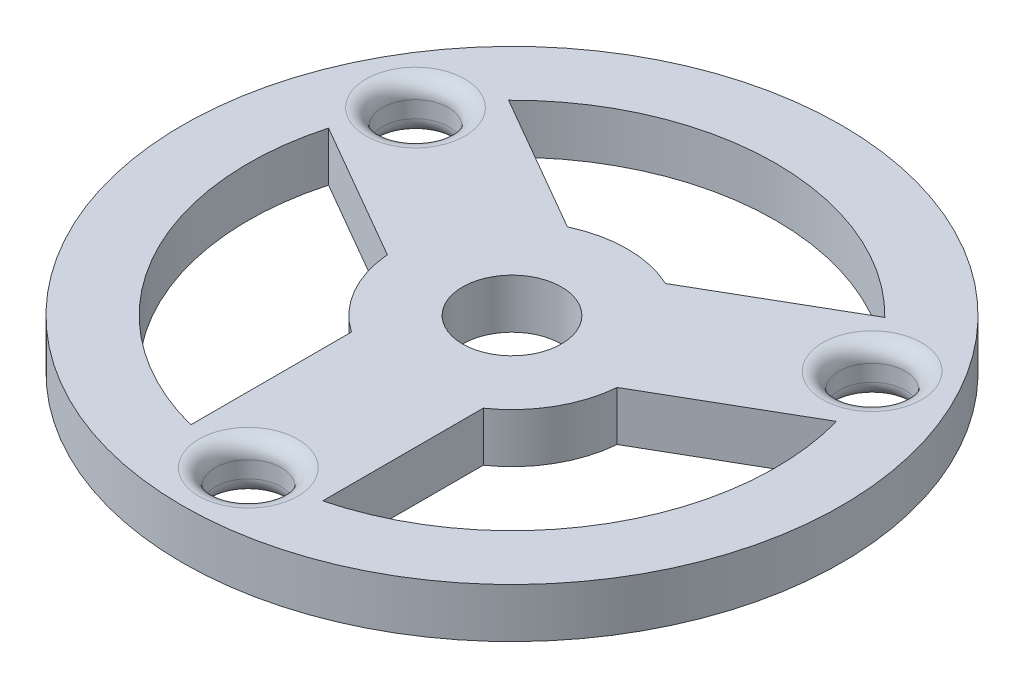
ISO-10303-21;
HEADER;
FILE_DESCRIPTION(('STEP AP214'),'2;1');
FILE_NAME('part.step','',(''),(''),'','','');
FILE_SCHEMA(('AUTOMOTIVE_DESIGN { 1 0 10303 214 1 1 1 1 }'));
ENDSEC;
DATA;
#1=APPLICATION_CONTEXT('core data for automotive mechanical design processes');
#2=APPLICATION_PROTOCOL_DEFINITION('international standard','automotive_design',2000,#1);
#3=PRODUCT_CONTEXT('',#1,'mechanical');
#4=PRODUCT('Part','Part','',(#3));
#5=PRODUCT_RELATED_PRODUCT_CATEGORY('part','',(#4));
#6=PRODUCT_DEFINITION_FORMATION('','',#4);
#7=PRODUCT_DEFINITION_CONTEXT('part definition',#1,'design');
#8=PRODUCT_DEFINITION('design','',#6,#7);
#9=PRODUCT_DEFINITION_SHAPE('','',#8);
#10=(LENGTH_UNIT() NAMED_UNIT(*) SI_UNIT(.MILLI.,.METRE.));
#11=(NAMED_UNIT(*) PLANE_ANGLE_UNIT() SI_UNIT($,.RADIAN.));
#12=(NAMED_UNIT(*) SI_UNIT($,.STERADIAN.) SOLID_ANGLE_UNIT());
#13=UNCERTAINTY_MEASURE_WITH_UNIT(LENGTH_MEASURE(1.E-05),#10,'distance_accuracy_value','');
#14=(GEOMETRIC_REPRESENTATION_CONTEXT(3) GLOBAL_UNCERTAINTY_ASSIGNED_CONTEXT((#13)) GLOBAL_UNIT_ASSIGNED_CONTEXT((#10,
#11,#12)) REPRESENTATION_CONTEXT('',''));
#15=CARTESIAN_POINT('',(0.,0.,0.));
#16=DIRECTION('',(0.,0.,1.));
#17=DIRECTION('',(1.,0.,0.));
#18=AXIS2_PLACEMENT_3D('',#15,#16,#17);
#19=CARTESIAN_POINT('',(0.,1.5,0.));
#20=DIRECTION('',(0.,1.,0.));
#21=DIRECTION('',(0.,0.,1.));
#22=AXIS2_PLACEMENT_3D('',#19,#20,#21);
#23=PLANE('',#22);
#24=CARTESIAN_POINT('',(0.,1.5,8.));
#25=DIRECTION('',(0.,1.,0.));
#26=DIRECTION('',(0.,0.,1.));
#27=AXIS2_PLACEMENT_3D('',#24,#25,#26);
#28=CIRCLE('',#27,1.5);
#29=CARTESIAN_POINT('',(0.,1.5,9.5));
#30=VERTEX_POINT('',#29);
#31=EDGE_CURVE('E249',#30,#30,#28,.F.);
#32=ORIENTED_EDGE('',*,*,#31,.T.);
#33=EDGE_LOOP('',(#32));
#34=FACE_BOUND('',#33,.T.);
#35=CARTESIAN_POINT('',(6.92820323027549,1.5,-4.00000000000003));
#36=DIRECTION('',(0.,1.,0.));
#37=DIRECTION('',(0.,0.,1.));
#38=AXIS2_PLACEMENT_3D('',#35,#36,#37);
#39=CIRCLE('',#38,1.5);
#40=CARTESIAN_POINT('',(6.92820323027549,1.5,-2.50000000000003));
#41=VERTEX_POINT('',#40);
#42=EDGE_CURVE('E246',#41,#41,#39,.F.);
#43=ORIENTED_EDGE('',*,*,#42,.T.);
#44=EDGE_LOOP('',(#43));
#45=FACE_BOUND('',#44,.T.);
#46=CARTESIAN_POINT('',(-6.92820323027552,1.5,-3.99999999999998));
#47=DIRECTION('',(0.,1.,0.));
#48=DIRECTION('',(0.,0.,1.));
#49=AXIS2_PLACEMENT_3D('',#46,#47,#48);
#50=CIRCLE('',#49,1.5);
#51=CARTESIAN_POINT('',(-6.92820323027552,1.5,-2.49999999999998));
#52=VERTEX_POINT('',#51);
#53=EDGE_CURVE('E243',#52,#52,#50,.F.);
#54=ORIENTED_EDGE('',*,*,#53,.T.);
#55=EDGE_LOOP('',(#54));
#56=FACE_BOUND('',#55,.T.);
#57=CARTESIAN_POINT('',(0.,1.5,0.));
#58=DIRECTION('',(0.,1.,0.));
#59=DIRECTION('',(0.,0.,1.));
#60=AXIS2_PLACEMENT_3D('',#57,#58,#59);
#61=CIRCLE('',#60,1.5);
#62=CARTESIAN_POINT('',(0.,1.5,1.5));
#63=VERTEX_POINT('',#62);
#64=EDGE_CURVE('E226',#63,#63,#61,.T.);
#65=ORIENTED_EDGE('',*,*,#64,.F.);
#66=EDGE_LOOP('',(#65));
#67=FACE_BOUND('',#66,.T.);
#68=CARTESIAN_POINT('',(0.,1.5,0.));
#69=DIRECTION('',(0.,1.,0.));
#70=DIRECTION('',(0.,0.,1.));
#71=AXIS2_PLACEMENT_3D('',#68,#69,#70);
#72=CIRCLE('',#71,10.);
#73=CARTESIAN_POINT('',(0.,1.5,10.));
#74=VERTEX_POINT('',#73);
#75=EDGE_CURVE('E232',#74,#74,#72,.T.);
#76=ORIENTED_EDGE('',*,*,#75,.T.);
#77=EDGE_LOOP('',(#76));
#78=FACE_BOUND('',#77,.T.);
#79=DIRECTION('',(0.86602540378444,0.,0.499999999999998));
#80=VECTOR('',#79,1.);
#81=CARTESIAN_POINT('',(-5.70820393249938,1.5,-5.60503415377628));
#82=LINE('',#81,#80);
#83=CARTESIAN_POINT('',(-5.70820393249938,1.5,-5.60503415377628));
#84=VERTEX_POINT('',#83);
#85=CARTESIAN_POINT('',(-1.48746859276656,1.5,-3.16819146920338));
#86=VERTEX_POINT('',#85);
#87=EDGE_CURVE('E197',#84,#86,#82,.T.);
#88=ORIENTED_EDGE('',*,*,#87,.F.);
#89=CARTESIAN_POINT('',(0.,1.5,0.));
#90=DIRECTION('',(0.,1.,0.));
#91=DIRECTION('',(0.,0.,-1.));
#92=AXIS2_PLACEMENT_3D('',#89,#90,#91);
#93=CIRCLE('',#92,8.);
#94=CARTESIAN_POINT('',(5.70820393249935,1.5,-5.60503415377632));
#95=VERTEX_POINT('',#94);
#96=EDGE_CURVE('E195',#95,#84,#93,.T.);
#97=ORIENTED_EDGE('',*,*,#96,.F.);
#98=DIRECTION('',(0.866025403784436,0.,-0.500000000000004));
#99=VECTOR('',#98,1.);
#100=CARTESIAN_POINT('',(1.48746859276654,1.5,-3.16819146920339));
#101=LINE('',#100,#99);
#102=CARTESIAN_POINT('',(1.48746859276654,1.5,-3.16819146920339));
#103=VERTEX_POINT('',#102);
#104=EDGE_CURVE('E203',#103,#95,#101,.T.);
#105=ORIENTED_EDGE('',*,*,#104,.F.);
#106=CARTESIAN_POINT('',(0.,1.5,0.));
#107=DIRECTION('',(0.,-1.,0.));
#108=DIRECTION('',(0.,0.,-1.));
#109=AXIS2_PLACEMENT_3D('',#106,#107,#108);
#110=CIRCLE('',#109,3.5);
#111=EDGE_CURVE('E200',#86,#103,#110,.T.);
#112=ORIENTED_EDGE('',*,*,#111,.F.);
#113=EDGE_LOOP('',(#88,#97,#105,#112));
#114=FACE_BOUND('',#113,.T.);
#115=DIRECTION('',(-0.86602540378444,0.,0.499999999999998));
#116=VECTOR('',#115,1.);
#117=CARTESIAN_POINT('',(7.70820393249937,1.5,-2.14093253863852));
#118=LINE('',#117,#116);
#119=CARTESIAN_POINT('',(7.70820393249937,1.5,-2.14093253863852));
#120=VERTEX_POINT('',#119);
#121=CARTESIAN_POINT('',(3.48746859276655,1.5,0.295910145934377));
#122=VERTEX_POINT('',#121);
#123=EDGE_CURVE('E166',#120,#122,#118,.T.);
#124=ORIENTED_EDGE('',*,*,#123,.F.);
#125=CARTESIAN_POINT('',(0.,1.5,0.));
#126=DIRECTION('',(0.,1.,0.));
#127=DIRECTION('',(0.,0.,-1.));
#128=AXIS2_PLACEMENT_3D('',#125,#126,#127);
#129=CIRCLE('',#128,8.);
#130=CARTESIAN_POINT('',(2.,1.5,7.74596669241484));
#131=VERTEX_POINT('',#130);
#132=EDGE_CURVE('E164',#131,#120,#129,.T.);
#133=ORIENTED_EDGE('',*,*,#132,.F.);
#134=DIRECTION('',(0.,0.,1.));
#135=VECTOR('',#134,1.);
#136=CARTESIAN_POINT('',(2.,1.5,2.87228132326902));
#137=LINE('',#136,#135);
#138=CARTESIAN_POINT('',(2.,1.5,2.87228132326902));
#139=VERTEX_POINT('',#138);
#140=EDGE_CURVE('E172',#139,#131,#137,.T.);
#141=ORIENTED_EDGE('',*,*,#140,.F.);
#142=CARTESIAN_POINT('',(0.,1.5,0.));
#143=DIRECTION('',(0.,-1.,0.));
#144=DIRECTION('',(0.,0.,-1.));
#145=AXIS2_PLACEMENT_3D('',#142,#143,#144);
#146=CIRCLE('',#145,3.5);
#147=EDGE_CURVE('E169',#122,#139,#146,.T.);
#148=ORIENTED_EDGE('',*,*,#147,.F.);
#149=EDGE_LOOP('',(#124,#133,#141,#148));
#150=FACE_BOUND('',#149,.T.);
#151=DIRECTION('',(0.,0.,-1.));
#152=VECTOR('',#151,1.);
#153=CARTESIAN_POINT('',(-2.00000000000005,1.5,7.74596669241482));
#154=LINE('',#153,#152);
#155=CARTESIAN_POINT('',(-2.00000000000005,1.5,7.74596669241482));
#156=VERTEX_POINT('',#155);
#157=CARTESIAN_POINT('',(-2.00000000000002,1.5,2.872281323269));
#158=VERTEX_POINT('',#157);
#159=EDGE_CURVE('E136',#156,#158,#154,.T.);
#160=ORIENTED_EDGE('',*,*,#159,.F.);
#161=CARTESIAN_POINT('',(0.,1.5,0.));
#162=DIRECTION('',(0.,1.,0.));
#163=DIRECTION('',(0.,0.,-1.));
#164=AXIS2_PLACEMENT_3D('',#161,#162,#163);
#165=CIRCLE('',#164,8.);
#166=CARTESIAN_POINT('',(-7.70820393249936,1.5,-2.14093253863858));
#167=VERTEX_POINT('',#166);
#168=EDGE_CURVE('E128',#167,#156,#165,.T.);
#169=ORIENTED_EDGE('',*,*,#168,.F.);
#170=DIRECTION('',(-0.866025403784436,0.,-0.500000000000004));
#171=VECTOR('',#170,1.);
#172=CARTESIAN_POINT('',(-3.48746859276655,1.5,0.295910145934348));
#173=LINE('',#172,#171);
#174=CARTESIAN_POINT('',(-3.48746859276655,1.5,0.295910145934348));
#175=VERTEX_POINT('',#174);
#176=EDGE_CURVE('E150',#175,#167,#173,.T.);
#177=ORIENTED_EDGE('',*,*,#176,.F.);
#178=CARTESIAN_POINT('',(0.,1.5,0.));
#179=DIRECTION('',(0.,-1.,0.));
#180=DIRECTION('',(0.,0.,-1.));
#181=AXIS2_PLACEMENT_3D('',#178,#179,#180);
#182=CIRCLE('',#181,3.5);
#183=EDGE_CURVE('E148',#158,#175,#182,.T.);
#184=ORIENTED_EDGE('',*,*,#183,.F.);
#185=EDGE_LOOP('',(#160,#169,#177,#184));
#186=FACE_BOUND('',#185,.T.);
#187=ADVANCED_FACE('F39',(#34,#45,#56,#67,#78,#114,#150,#186),#23,.T.);
#188=CARTESIAN_POINT('',(0.,0.,0.));
#189=DIRECTION('',(0.,1.,0.));
#190=DIRECTION('',(0.,0.,1.));
#191=AXIS2_PLACEMENT_3D('',#188,#189,#190);
#192=PLANE('',#191);
#193=CARTESIAN_POINT('',(-6.92820323027552,0.,-3.99999999999998));
#194=DIRECTION('',(0.,1.,0.));
#195=DIRECTION('',(0.,0.,1.));
#196=AXIS2_PLACEMENT_3D('',#193,#194,#195);
#197=CIRCLE('',#196,1.5);
#198=CARTESIAN_POINT('',(-6.92820323027552,0.,-2.49999999999998));
#199=VERTEX_POINT('',#198);
#200=EDGE_CURVE('E258',#199,#199,#197,.T.);
#201=ORIENTED_EDGE('',*,*,#200,.T.);
#202=EDGE_LOOP('',(#201));
#203=FACE_BOUND('',#202,.T.);
#204=CARTESIAN_POINT('',(6.92820323027549,0.,-4.00000000000003));
#205=DIRECTION('',(0.,1.,0.));
#206=DIRECTION('',(0.,0.,1.));
#207=AXIS2_PLACEMENT_3D('',#204,#205,#206);
#208=CIRCLE('',#207,1.5);
#209=CARTESIAN_POINT('',(6.92820323027549,0.,-2.50000000000003));
#210=VERTEX_POINT('',#209);
#211=EDGE_CURVE('E255',#210,#210,#208,.T.);
#212=ORIENTED_EDGE('',*,*,#211,.T.);
#213=EDGE_LOOP('',(#212));
#214=FACE_BOUND('',#213,.T.);
#215=CARTESIAN_POINT('',(0.,0.,8.));
#216=DIRECTION('',(0.,1.,0.));
#217=DIRECTION('',(0.,0.,1.));
#218=AXIS2_PLACEMENT_3D('',#215,#216,#217);
#219=CIRCLE('',#218,1.5);
#220=CARTESIAN_POINT('',(0.,0.,9.5));
#221=VERTEX_POINT('',#220);
#222=EDGE_CURVE('E252',#221,#221,#219,.T.);
#223=ORIENTED_EDGE('',*,*,#222,.T.);
#224=EDGE_LOOP('',(#223));
#225=FACE_BOUND('',#224,.T.);
#226=CARTESIAN_POINT('',(0.,0.,0.));
#227=DIRECTION('',(0.,1.,0.));
#228=DIRECTION('',(0.,0.,-1.));
#229=AXIS2_PLACEMENT_3D('',#226,#227,#228);
#230=CIRCLE('',#229,8.);
#231=CARTESIAN_POINT('',(2.,0.,7.74596669241484));
#232=VERTEX_POINT('',#231);
#233=CARTESIAN_POINT('',(7.70820393249937,0.,-2.14093253863852));
#234=VERTEX_POINT('',#233);
#235=EDGE_CURVE('E144',#232,#234,#230,.T.);
#236=ORIENTED_EDGE('',*,*,#235,.T.);
#237=DIRECTION('',(-0.86602540378444,0.,0.499999999999998));
#238=VECTOR('',#237,1.);
#239=CARTESIAN_POINT('',(7.70820393249937,0.,-2.14093253863852));
#240=LINE('',#239,#238);
#241=CARTESIAN_POINT('',(3.48746859276655,0.,0.295910145934377));
#242=VERTEX_POINT('',#241);
#243=EDGE_CURVE('E177',#234,#242,#240,.T.);
#244=ORIENTED_EDGE('',*,*,#243,.T.);
#245=CARTESIAN_POINT('',(0.,0.,0.));
#246=DIRECTION('',(0.,-1.,0.));
#247=DIRECTION('',(0.,0.,-1.));
#248=AXIS2_PLACEMENT_3D('',#245,#246,#247);
#249=CIRCLE('',#248,3.5);
#250=CARTESIAN_POINT('',(2.,0.,2.87228132326902));
#251=VERTEX_POINT('',#250);
#252=EDGE_CURVE('E180',#242,#251,#249,.T.);
#253=ORIENTED_EDGE('',*,*,#252,.T.);
#254=DIRECTION('',(0.,0.,1.));
#255=VECTOR('',#254,1.);
#256=CARTESIAN_POINT('',(2.,0.,2.87228132326902));
#257=LINE('',#256,#255);
#258=EDGE_CURVE('E167',#251,#232,#257,.T.);
#259=ORIENTED_EDGE('',*,*,#258,.T.);
#260=EDGE_LOOP('',(#236,#244,#253,#259));
#261=FACE_BOUND('',#260,.T.);
#262=CARTESIAN_POINT('',(0.,0.,0.));
#263=DIRECTION('',(0.,1.,0.));
#264=DIRECTION('',(0.,0.,1.));
#265=AXIS2_PLACEMENT_3D('',#262,#263,#264);
#266=CIRCLE('',#265,1.5);
#267=CARTESIAN_POINT('',(0.,0.,1.5));
#268=VERTEX_POINT('',#267);
#269=EDGE_CURVE('E225',#268,#268,#266,.T.);
#270=ORIENTED_EDGE('',*,*,#269,.T.);
#271=EDGE_LOOP('',(#270));
#272=FACE_BOUND('',#271,.T.);
#273=CARTESIAN_POINT('',(0.,0.,0.));
#274=DIRECTION('',(0.,1.,0.));
#275=DIRECTION('',(0.,0.,1.));
#276=AXIS2_PLACEMENT_3D('',#273,#274,#275);
#277=CIRCLE('',#276,10.);
#278=CARTESIAN_POINT('',(0.,0.,10.));
#279=VERTEX_POINT('',#278);
#280=EDGE_CURVE('E229',#279,#279,#277,.T.);
#281=ORIENTED_EDGE('',*,*,#280,.F.);
#282=EDGE_LOOP('',(#281));
#283=FACE_BOUND('',#282,.T.);
#284=CARTESIAN_POINT('',(0.,0.,0.));
#285=DIRECTION('',(0.,1.,0.));
#286=DIRECTION('',(0.,0.,-1.));
#287=AXIS2_PLACEMENT_3D('',#284,#285,#286);
#288=CIRCLE('',#287,8.);
#289=CARTESIAN_POINT('',(5.70820393249935,0.,-5.60503415377632));
#290=VERTEX_POINT('',#289);
#291=CARTESIAN_POINT('',(-5.70820393249938,0.,-5.60503415377628));
#292=VERTEX_POINT('',#291);
#293=EDGE_CURVE('E194',#290,#292,#288,.T.);
#294=ORIENTED_EDGE('',*,*,#293,.T.);
#295=DIRECTION('',(0.86602540378444,0.,0.499999999999998));
#296=VECTOR('',#295,1.);
#297=CARTESIAN_POINT('',(-5.70820393249938,0.,-5.60503415377628));
#298=LINE('',#297,#296);
#299=CARTESIAN_POINT('',(-1.48746859276656,0.,-3.16819146920338));
#300=VERTEX_POINT('',#299);
#301=EDGE_CURVE('E208',#292,#300,#298,.T.);
#302=ORIENTED_EDGE('',*,*,#301,.T.);
#303=CARTESIAN_POINT('',(0.,0.,0.));
#304=DIRECTION('',(0.,-1.,0.));
#305=DIRECTION('',(0.,0.,-1.));
#306=AXIS2_PLACEMENT_3D('',#303,#304,#305);
#307=CIRCLE('',#306,3.5);
#308=CARTESIAN_POINT('',(1.48746859276654,0.,-3.16819146920339));
#309=VERTEX_POINT('',#308);
#310=EDGE_CURVE('E211',#300,#309,#307,.T.);
#311=ORIENTED_EDGE('',*,*,#310,.T.);
#312=DIRECTION('',(0.866025403784436,0.,-0.500000000000004));
#313=VECTOR('',#312,1.);
#314=CARTESIAN_POINT('',(1.48746859276654,0.,-3.16819146920339));
#315=LINE('',#314,#313);
#316=EDGE_CURVE('E198',#309,#290,#315,.T.);
#317=ORIENTED_EDGE('',*,*,#316,.T.);
#318=EDGE_LOOP('',(#294,#302,#311,#317));
#319=FACE_BOUND('',#318,.T.);
#320=CARTESIAN_POINT('',(0.,0.,0.));
#321=DIRECTION('',(0.,1.,0.));
#322=DIRECTION('',(0.,0.,-1.));
#323=AXIS2_PLACEMENT_3D('',#320,#321,#322);
#324=CIRCLE('',#323,8.);
#325=CARTESIAN_POINT('',(-7.70820393249936,0.,-2.14093253863858));
#326=VERTEX_POINT('',#325);
#327=CARTESIAN_POINT('',(-2.00000000000005,0.,7.74596669241482));
#328=VERTEX_POINT('',#327);
#329=EDGE_CURVE('E62',#326,#328,#324,.T.);
#330=ORIENTED_EDGE('',*,*,#329,.T.);
#331=DIRECTION('',(0.,0.,-1.));
#332=VECTOR('',#331,1.);
#333=CARTESIAN_POINT('',(-2.00000000000005,0.,7.74596669241482));
#334=LINE('',#333,#332);
#335=CARTESIAN_POINT('',(-2.00000000000002,0.,2.872281323269));
#336=VERTEX_POINT('',#335);
#337=EDGE_CURVE('E143',#328,#336,#334,.T.);
#338=ORIENTED_EDGE('',*,*,#337,.T.);
#339=CARTESIAN_POINT('',(0.,0.,0.));
#340=DIRECTION('',(0.,-1.,0.));
#341=DIRECTION('',(0.,0.,-1.));
#342=AXIS2_PLACEMENT_3D('',#339,#340,#341);
#343=CIRCLE('',#342,3.5);
#344=CARTESIAN_POINT('',(-3.48746859276655,0.,0.295910145934349));
#345=VERTEX_POINT('',#344);
#346=EDGE_CURVE('E156',#336,#345,#343,.T.);
#347=ORIENTED_EDGE('',*,*,#346,.T.);
#348=DIRECTION('',(-0.866025403784436,0.,-0.500000000000004));
#349=VECTOR('',#348,1.);
#350=CARTESIAN_POINT('',(-3.48746859276655,0.,0.295910145934348));
#351=LINE('',#350,#349);
#352=EDGE_CURVE('E137',#345,#326,#351,.T.);
#353=ORIENTED_EDGE('',*,*,#352,.T.);
#354=EDGE_LOOP('',(#330,#338,#347,#353));
#355=FACE_BOUND('',#354,.T.);
#356=ADVANCED_FACE('F285',(#203,#214,#225,#261,#272,#283,#319,#355),#192,.F.);
#357=CARTESIAN_POINT('',(0.,1.5,0.));
#358=DIRECTION('',(0.,-1.,0.));
#359=DIRECTION('',(0.,0.,-1.));
#360=AXIS2_PLACEMENT_3D('',#357,#358,#359);
#361=CYLINDRICAL_SURFACE('',#360,10.);
#362=ORIENTED_EDGE('',*,*,#75,.F.);
#363=EDGE_LOOP('',(#362));
#364=FACE_BOUND('',#363,.T.);
#365=ORIENTED_EDGE('',*,*,#280,.T.);
#366=EDGE_LOOP('',(#365));
#367=FACE_BOUND('',#366,.T.);
#368=ADVANCED_FACE('F292',(#364,#367),#361,.T.);
#369=CARTESIAN_POINT('',(0.,1.5,0.));
#370=DIRECTION('',(0.,-1.,0.));
#371=DIRECTION('',(0.,0.,-1.));
#372=AXIS2_PLACEMENT_3D('',#369,#370,#371);
#373=CYLINDRICAL_SURFACE('',#372,1.5);
#374=ORIENTED_EDGE('',*,*,#64,.T.);
#375=EDGE_LOOP('',(#374));
#376=FACE_BOUND('',#375,.T.);
#377=ORIENTED_EDGE('',*,*,#269,.F.);
#378=EDGE_LOOP('',(#377));
#379=FACE_BOUND('',#378,.T.);
#380=ADVANCED_FACE('F297',(#376,#379),#373,.F.);
#381=CARTESIAN_POINT('',(-6.92820323027552,1.5,-3.99999999999998));
#382=DIRECTION('',(0.,-1.,0.));
#383=DIRECTION('',(0.,0.,-1.));
#384=AXIS2_PLACEMENT_3D('',#381,#382,#383);
#385=CYLINDRICAL_SURFACE('',#384,0.999999999999999);
#386=CARTESIAN_POINT('',(-6.92820323027552,0.5,-3.99999999999998));
#387=DIRECTION('',(0.,1.,0.));
#388=DIRECTION('',(0.,0.,1.));
#389=AXIS2_PLACEMENT_3D('',#386,#387,#388);
#390=CIRCLE('',#389,0.999999999999999);
#391=CARTESIAN_POINT('',(-6.92820323027552,0.5,-2.99999999999998));
#392=VERTEX_POINT('',#391);
#393=EDGE_CURVE('E264',#392,#392,#390,.F.);
#394=ORIENTED_EDGE('',*,*,#393,.T.);
#395=EDGE_LOOP('',(#394));
#396=FACE_BOUND('',#395,.T.);
#397=CARTESIAN_POINT('',(-6.92820323027552,1.,-3.99999999999998));
#398=DIRECTION('',(0.,1.,0.));
#399=DIRECTION('',(0.,0.,1.));
#400=AXIS2_PLACEMENT_3D('',#397,#398,#399);
#401=CIRCLE('',#400,0.999999999999999);
#402=CARTESIAN_POINT('',(-6.92820323027552,1.,-2.99999999999998));
#403=VERTEX_POINT('',#402);
#404=EDGE_CURVE('E261',#403,#403,#401,.T.);
#405=ORIENTED_EDGE('',*,*,#404,.T.);
#406=EDGE_LOOP('',(#405));
#407=FACE_BOUND('',#406,.T.);
#408=ADVANCED_FACE('F379',(#396,#407),#385,.F.);
#409=CARTESIAN_POINT('',(6.92820323027549,1.5,-4.00000000000003));
#410=DIRECTION('',(0.,-1.,0.));
#411=DIRECTION('',(0.,0.,-1.));
#412=AXIS2_PLACEMENT_3D('',#409,#410,#411);
#413=CYLINDRICAL_SURFACE('',#412,1.);
#414=CARTESIAN_POINT('',(6.92820323027549,0.5,-4.00000000000003));
#415=DIRECTION('',(0.,1.,0.));
#416=DIRECTION('',(0.,0.,1.));
#417=AXIS2_PLACEMENT_3D('',#414,#415,#416);
#418=CIRCLE('',#417,1.);
#419=CARTESIAN_POINT('',(6.92820323027549,0.5,-3.00000000000003));
#420=VERTEX_POINT('',#419);
#421=EDGE_CURVE('E11',#420,#420,#418,.F.);
#422=ORIENTED_EDGE('',*,*,#421,.T.);
#423=EDGE_LOOP('',(#422));
#424=FACE_BOUND('',#423,.T.);
#425=CARTESIAN_POINT('',(6.92820323027549,1.,-4.00000000000003));
#426=DIRECTION('',(0.,1.,0.));
#427=DIRECTION('',(0.,0.,1.));
#428=AXIS2_PLACEMENT_3D('',#425,#426,#427);
#429=CIRCLE('',#428,1.);
#430=CARTESIAN_POINT('',(6.92820323027549,1.,-3.00000000000003));
#431=VERTEX_POINT('',#430);
#432=EDGE_CURVE('E47',#431,#431,#429,.T.);
#433=ORIENTED_EDGE('',*,*,#432,.T.);
#434=EDGE_LOOP('',(#433));
#435=FACE_BOUND('',#434,.T.);
#436=ADVANCED_FACE('F269',(#424,#435),#413,.F.);
#437=CARTESIAN_POINT('',(0.,1.5,8.));
#438=DIRECTION('',(0.,-1.,0.));
#439=DIRECTION('',(0.,0.,-1.));
#440=AXIS2_PLACEMENT_3D('',#437,#438,#439);
#441=CYLINDRICAL_SURFACE('',#440,1.);
#442=CARTESIAN_POINT('',(0.,1.,8.));
#443=DIRECTION('',(0.,1.,0.));
#444=DIRECTION('',(0.,0.,1.));
#445=AXIS2_PLACEMENT_3D('',#442,#443,#444);
#446=CIRCLE('',#445,1.);
#447=CARTESIAN_POINT('',(0.,1.,9.));
#448=VERTEX_POINT('',#447);
#449=EDGE_CURVE('E240',#448,#448,#446,.T.);
#450=ORIENTED_EDGE('',*,*,#449,.T.);
#451=EDGE_LOOP('',(#450));
#452=FACE_BOUND('',#451,.T.);
#453=CARTESIAN_POINT('',(0.,0.5,8.));
#454=DIRECTION('',(0.,1.,0.));
#455=DIRECTION('',(0.,0.,1.));
#456=AXIS2_PLACEMENT_3D('',#453,#454,#455);
#457=CIRCLE('',#456,1.);
#458=CARTESIAN_POINT('',(0.,0.5,9.));
#459=VERTEX_POINT('',#458);
#460=EDGE_CURVE('E235',#459,#459,#457,.F.);
#461=ORIENTED_EDGE('',*,*,#460,.T.);
#462=EDGE_LOOP('',(#461));
#463=FACE_BOUND('',#462,.T.);
#464=ADVANCED_FACE('F373',(#452,#463),#441,.F.);
#465=CARTESIAN_POINT('',(0.,1.5,0.));
#466=DIRECTION('',(0.,-1.,0.));
#467=DIRECTION('',(0.,0.,-1.));
#468=AXIS2_PLACEMENT_3D('',#465,#466,#467);
#469=CYLINDRICAL_SURFACE('',#468,8.);
#470=ORIENTED_EDGE('',*,*,#293,.F.);
#471=DIRECTION('',(0.,-1.,0.));
#472=VECTOR('',#471,1.);
#473=CARTESIAN_POINT('',(5.70820393249935,1.5,-5.60503415377632));
#474=LINE('',#473,#472);
#475=EDGE_CURVE('E205',#95,#290,#474,.T.);
#476=ORIENTED_EDGE('',*,*,#475,.F.);
#477=ORIENTED_EDGE('',*,*,#96,.T.);
#478=DIRECTION('',(0.,-1.,0.));
#479=VECTOR('',#478,1.);
#480=CARTESIAN_POINT('',(-5.70820393249938,1.5,-5.60503415377628));
#481=LINE('',#480,#479);
#482=EDGE_CURVE('E222',#84,#292,#481,.T.);
#483=ORIENTED_EDGE('',*,*,#482,.T.);
#484=EDGE_LOOP('',(#470,#476,#477,#483));
#485=FACE_BOUND('',#484,.T.);
#486=ADVANCED_FACE('F369',(#485),#469,.F.);
#487=CARTESIAN_POINT('',(-5.70820393249938,1.5,-5.60503415377628));
#488=DIRECTION('',(0.499999999999998,0.,-0.86602540378444));
#489=DIRECTION('',(-0.86602540378444,0.,-0.499999999999998));
#490=AXIS2_PLACEMENT_3D('',#487,#488,#489);
#491=PLANE('',#490);
#492=ORIENTED_EDGE('',*,*,#301,.F.);
#493=ORIENTED_EDGE('',*,*,#482,.F.);
#494=ORIENTED_EDGE('',*,*,#87,.T.);
#495=DIRECTION('',(0.,-1.,0.));
#496=VECTOR('',#495,1.);
#497=CARTESIAN_POINT('',(-1.48746859276656,1.5,-3.16819146920338));
#498=LINE('',#497,#496);
#499=EDGE_CURVE('E220',#86,#300,#498,.T.);
#500=ORIENTED_EDGE('',*,*,#499,.T.);
#501=EDGE_LOOP('',(#492,#493,#494,#500));
#502=FACE_BOUND('',#501,.T.);
#503=ADVANCED_FACE('F365',(#502),#491,.T.);
#504=CARTESIAN_POINT('',(0.,1.5,0.));
#505=DIRECTION('',(0.,-1.,0.));
#506=DIRECTION('',(0.,0.,-1.));
#507=AXIS2_PLACEMENT_3D('',#504,#505,#506);
#508=CYLINDRICAL_SURFACE('',#507,3.5);
#509=ORIENTED_EDGE('',*,*,#310,.F.);
#510=ORIENTED_EDGE('',*,*,#499,.F.);
#511=ORIENTED_EDGE('',*,*,#111,.T.);
#512=DIRECTION('',(0.,-1.,0.));
#513=VECTOR('',#512,1.);
#514=CARTESIAN_POINT('',(1.48746859276654,1.5,-3.16819146920339));
#515=LINE('',#514,#513);
#516=EDGE_CURVE('E218',#103,#309,#515,.T.);
#517=ORIENTED_EDGE('',*,*,#516,.T.);
#518=EDGE_LOOP('',(#509,#510,#511,#517));
#519=FACE_BOUND('',#518,.T.);
#520=ADVANCED_FACE('F361',(#519),#508,.T.);
#521=CARTESIAN_POINT('',(1.48746859276654,1.5,-3.16819146920339));
#522=DIRECTION('',(-0.500000000000004,0.,-0.866025403784436));
#523=DIRECTION('',(-0.866025403784436,0.,0.500000000000004));
#524=AXIS2_PLACEMENT_3D('',#521,#522,#523);
#525=PLANE('',#524);
#526=ORIENTED_EDGE('',*,*,#316,.F.);
#527=ORIENTED_EDGE('',*,*,#516,.F.);
#528=ORIENTED_EDGE('',*,*,#104,.T.);
#529=ORIENTED_EDGE('',*,*,#475,.T.);
#530=EDGE_LOOP('',(#526,#527,#528,#529));
#531=FACE_BOUND('',#530,.T.);
#532=ADVANCED_FACE('F357',(#531),#525,.T.);
#533=CARTESIAN_POINT('',(0.,1.5,0.));
#534=DIRECTION('',(0.,-1.,0.));
#535=DIRECTION('',(0.,0.,-1.));
#536=AXIS2_PLACEMENT_3D('',#533,#534,#535);
#537=CYLINDRICAL_SURFACE('',#536,8.);
#538=ORIENTED_EDGE('',*,*,#235,.F.);
#539=DIRECTION('',(0.,-1.,0.));
#540=VECTOR('',#539,1.);
#541=CARTESIAN_POINT('',(2.,1.5,7.74596669241484));
#542=LINE('',#541,#540);
#543=EDGE_CURVE('E174',#131,#232,#542,.T.);
#544=ORIENTED_EDGE('',*,*,#543,.F.);
#545=ORIENTED_EDGE('',*,*,#132,.T.);
#546=DIRECTION('',(0.,-1.,0.));
#547=VECTOR('',#546,1.);
#548=CARTESIAN_POINT('',(7.70820393249937,1.5,-2.14093253863852));
#549=LINE('',#548,#547);
#550=EDGE_CURVE('E191',#120,#234,#549,.T.);
#551=ORIENTED_EDGE('',*,*,#550,.T.);
#552=EDGE_LOOP('',(#538,#544,#545,#551));
#553=FACE_BOUND('',#552,.T.);
#554=ADVANCED_FACE('F353',(#553),#537,.F.);
#555=CARTESIAN_POINT('',(7.70820393249937,1.5,-2.14093253863852));
#556=DIRECTION('',(0.499999999999998,0.,0.86602540378444));
#557=DIRECTION('',(0.86602540378444,0.,-0.499999999999998));
#558=AXIS2_PLACEMENT_3D('',#555,#556,#557);
#559=PLANE('',#558);
#560=ORIENTED_EDGE('',*,*,#243,.F.);
#561=ORIENTED_EDGE('',*,*,#550,.F.);
#562=ORIENTED_EDGE('',*,*,#123,.T.);
#563=DIRECTION('',(0.,-1.,0.));
#564=VECTOR('',#563,1.);
#565=CARTESIAN_POINT('',(3.48746859276655,1.5,0.295910145934377));
#566=LINE('',#565,#564);
#567=EDGE_CURVE('E189',#122,#242,#566,.T.);
#568=ORIENTED_EDGE('',*,*,#567,.T.);
#569=EDGE_LOOP('',(#560,#561,#562,#568));
#570=FACE_BOUND('',#569,.T.);
#571=ADVANCED_FACE('F349',(#570),#559,.T.);
#572=CARTESIAN_POINT('',(0.,1.5,0.));
#573=DIRECTION('',(0.,-1.,0.));
#574=DIRECTION('',(0.,0.,-1.));
#575=AXIS2_PLACEMENT_3D('',#572,#573,#574);
#576=CYLINDRICAL_SURFACE('',#575,3.5);
#577=ORIENTED_EDGE('',*,*,#252,.F.);
#578=ORIENTED_EDGE('',*,*,#567,.F.);
#579=ORIENTED_EDGE('',*,*,#147,.T.);
#580=DIRECTION('',(0.,-1.,0.));
#581=VECTOR('',#580,1.);
#582=CARTESIAN_POINT('',(2.,1.5,2.87228132326902));
#583=LINE('',#582,#581);
#584=EDGE_CURVE('E187',#139,#251,#583,.T.);
#585=ORIENTED_EDGE('',*,*,#584,.T.);
#586=EDGE_LOOP('',(#577,#578,#579,#585));
#587=FACE_BOUND('',#586,.T.);
#588=ADVANCED_FACE('F345',(#587),#576,.T.);
#589=CARTESIAN_POINT('',(2.,1.5,2.87228132326902));
#590=DIRECTION('',(1.,0.,0.));
#591=DIRECTION('',(0.,0.,-1.));
#592=AXIS2_PLACEMENT_3D('',#589,#590,#591);
#593=PLANE('',#592);
#594=ORIENTED_EDGE('',*,*,#258,.F.);
#595=ORIENTED_EDGE('',*,*,#584,.F.);
#596=ORIENTED_EDGE('',*,*,#140,.T.);
#597=ORIENTED_EDGE('',*,*,#543,.T.);
#598=EDGE_LOOP('',(#594,#595,#596,#597));
#599=FACE_BOUND('',#598,.T.);
#600=ADVANCED_FACE('F342',(#599),#593,.T.);
#601=CARTESIAN_POINT('',(0.,1.5,0.));
#602=DIRECTION('',(0.,-1.,0.));
#603=DIRECTION('',(0.,0.,-1.));
#604=AXIS2_PLACEMENT_3D('',#601,#602,#603);
#605=CYLINDRICAL_SURFACE('',#604,8.);
#606=ORIENTED_EDGE('',*,*,#329,.F.);
#607=DIRECTION('',(0.,-1.,0.));
#608=VECTOR('',#607,1.);
#609=CARTESIAN_POINT('',(-7.70820393249936,1.5,-2.14093253863858));
#610=LINE('',#609,#608);
#611=EDGE_CURVE('E132',#167,#326,#610,.T.);
#612=ORIENTED_EDGE('',*,*,#611,.F.);
#613=ORIENTED_EDGE('',*,*,#168,.T.);
#614=DIRECTION('',(0.,-1.,0.));
#615=VECTOR('',#614,1.);
#616=CARTESIAN_POINT('',(-2.00000000000005,1.5,7.74596669241482));
#617=LINE('',#616,#615);
#618=EDGE_CURVE('E131',#156,#328,#617,.T.);
#619=ORIENTED_EDGE('',*,*,#618,.T.);
#620=EDGE_LOOP('',(#606,#612,#613,#619));
#621=FACE_BOUND('',#620,.T.);
#622=ADVANCED_FACE('F130',(#621),#605,.F.);
#623=CARTESIAN_POINT('',(-2.00000000000005,1.5,7.74596669241482));
#624=DIRECTION('',(-1.,0.,0.));
#625=DIRECTION('',(0.,0.,1.));
#626=AXIS2_PLACEMENT_3D('',#623,#624,#625);
#627=PLANE('',#626);
#628=ORIENTED_EDGE('',*,*,#337,.F.);
#629=ORIENTED_EDGE('',*,*,#618,.F.);
#630=ORIENTED_EDGE('',*,*,#159,.T.);
#631=DIRECTION('',(0.,-1.,0.));
#632=VECTOR('',#631,1.);
#633=CARTESIAN_POINT('',(-2.00000000000002,1.5,2.872281323269));
#634=LINE('',#633,#632);
#635=EDGE_CURVE('E145',#158,#336,#634,.T.);
#636=ORIENTED_EDGE('',*,*,#635,.T.);
#637=EDGE_LOOP('',(#628,#629,#630,#636));
#638=FACE_BOUND('',#637,.T.);
#639=ADVANCED_FACE('F140',(#638),#627,.T.);
#640=CARTESIAN_POINT('',(0.,1.5,0.));
#641=DIRECTION('',(0.,-1.,0.));
#642=DIRECTION('',(0.,0.,-1.));
#643=AXIS2_PLACEMENT_3D('',#640,#641,#642);
#644=CYLINDRICAL_SURFACE('',#643,3.5);
#645=ORIENTED_EDGE('',*,*,#346,.F.);
#646=ORIENTED_EDGE('',*,*,#635,.F.);
#647=ORIENTED_EDGE('',*,*,#183,.T.);
#648=DIRECTION('',(0.,-1.,0.));
#649=VECTOR('',#648,1.);
#650=CARTESIAN_POINT('',(-3.48746859276655,1.5,0.295910145934349));
#651=LINE('',#650,#649);
#652=EDGE_CURVE('E54',#175,#345,#651,.T.);
#653=ORIENTED_EDGE('',*,*,#652,.T.);
#654=EDGE_LOOP('',(#645,#646,#647,#653));
#655=FACE_BOUND('',#654,.T.);
#656=ADVANCED_FACE('F330',(#655),#644,.T.);
#657=CARTESIAN_POINT('',(-3.48746859276655,1.5,0.295910145934348));
#658=DIRECTION('',(-0.500000000000004,0.,0.866025403784437));
#659=DIRECTION('',(0.866025403784437,0.,0.500000000000004));
#660=AXIS2_PLACEMENT_3D('',#657,#658,#659);
#661=PLANE('',#660);
#662=ORIENTED_EDGE('',*,*,#352,.F.);
#663=ORIENTED_EDGE('',*,*,#652,.F.);
#664=ORIENTED_EDGE('',*,*,#176,.T.);
#665=ORIENTED_EDGE('',*,*,#611,.T.);
#666=EDGE_LOOP('',(#662,#663,#664,#665));
#667=FACE_BOUND('',#666,.T.);
#668=ADVANCED_FACE('F307',(#667),#661,.T.);
#669=CARTESIAN_POINT('',(0.,1.,8.));
#670=DIRECTION('',(0.,1.,0.));
#671=DIRECTION('',(0.,0.,1.));
#672=AXIS2_PLACEMENT_3D('',#669,#670,#671);
#673=TOROIDAL_SURFACE('',#672,1.5,0.5);
#674=ORIENTED_EDGE('',*,*,#31,.F.);
#675=EDGE_LOOP('',(#674));
#676=FACE_BOUND('',#675,.T.);
#677=ORIENTED_EDGE('',*,*,#449,.F.);
#678=EDGE_LOOP('',(#677));
#679=FACE_BOUND('',#678,.T.);
#680=ADVANCED_FACE('F303',(#676,#679),#673,.T.);
#681=CARTESIAN_POINT('',(-6.92820323027552,0.5,-3.99999999999998));
#682=DIRECTION('',(0.,1.,0.));
#683=DIRECTION('',(0.,0.,1.));
#684=AXIS2_PLACEMENT_3D('',#681,#682,#683);
#685=TOROIDAL_SURFACE('',#684,1.5,0.5);
#686=ORIENTED_EDGE('',*,*,#393,.F.);
#687=EDGE_LOOP('',(#686));
#688=FACE_BOUND('',#687,.T.);
#689=ORIENTED_EDGE('',*,*,#200,.F.);
#690=EDGE_LOOP('',(#689));
#691=FACE_BOUND('',#690,.T.);
#692=ADVANCED_FACE('F306',(#688,#691),#685,.T.);
#693=CARTESIAN_POINT('',(6.92820323027549,0.5,-4.00000000000003));
#694=DIRECTION('',(0.,1.,0.));
#695=DIRECTION('',(0.,0.,1.));
#696=AXIS2_PLACEMENT_3D('',#693,#694,#695);
#697=TOROIDAL_SURFACE('',#696,1.5,0.5);
#698=ORIENTED_EDGE('',*,*,#421,.F.);
#699=EDGE_LOOP('',(#698));
#700=FACE_BOUND('',#699,.T.);
#701=ORIENTED_EDGE('',*,*,#211,.F.);
#702=EDGE_LOOP('',(#701));
#703=FACE_BOUND('',#702,.T.);
#704=ADVANCED_FACE('F280',(#700,#703),#697,.T.);
#705=CARTESIAN_POINT('',(0.,0.5,8.));
#706=DIRECTION('',(0.,1.,0.));
#707=DIRECTION('',(0.,0.,1.));
#708=AXIS2_PLACEMENT_3D('',#705,#706,#707);
#709=TOROIDAL_SURFACE('',#708,1.5,0.5);
#710=ORIENTED_EDGE('',*,*,#460,.F.);
#711=EDGE_LOOP('',(#710));
#712=FACE_BOUND('',#711,.T.);
#713=ORIENTED_EDGE('',*,*,#222,.F.);
#714=EDGE_LOOP('',(#713));
#715=FACE_BOUND('',#714,.T.);
#716=ADVANCED_FACE('F273',(#712,#715),#709,.T.);
#717=CARTESIAN_POINT('',(6.92820323027549,1.,-4.00000000000003));
#718=DIRECTION('',(0.,1.,0.));
#719=DIRECTION('',(0.,0.,1.));
#720=AXIS2_PLACEMENT_3D('',#717,#718,#719);
#721=TOROIDAL_SURFACE('',#720,1.5,0.5);
#722=ORIENTED_EDGE('',*,*,#42,.F.);
#723=EDGE_LOOP('',(#722));
#724=FACE_BOUND('',#723,.T.);
#725=ORIENTED_EDGE('',*,*,#432,.F.);
#726=EDGE_LOOP('',(#725));
#727=FACE_BOUND('',#726,.T.);
#728=ADVANCED_FACE('F271',(#724,#727),#721,.T.);
#729=CARTESIAN_POINT('',(-6.92820323027552,1.,-3.99999999999998));
#730=DIRECTION('',(0.,1.,0.));
#731=DIRECTION('',(0.,0.,1.));
#732=AXIS2_PLACEMENT_3D('',#729,#730,#731);
#733=TOROIDAL_SURFACE('',#732,1.5,0.5);
#734=ORIENTED_EDGE('',*,*,#53,.F.);
#735=EDGE_LOOP('',(#734));
#736=FACE_BOUND('',#735,.T.);
#737=ORIENTED_EDGE('',*,*,#404,.F.);
#738=EDGE_LOOP('',(#737));
#739=FACE_BOUND('',#738,.T.);
#740=ADVANCED_FACE('F41',(#736,#739),#733,.T.);
#741=CLOSED_SHELL('',(#187,#356,#368,#380,#408,#436,#464,#486,#503,#520,#532,#554,#571,#588,
#600,#622,#639,#656,#668,#680,#692,#704,#716,#728,#740));
#742=MANIFOLD_SOLID_BREP('B2',#741);
#743=ADVANCED_BREP_SHAPE_REPRESENTATION('',(#18,#742),#14);
#744=SHAPE_DEFINITION_REPRESENTATION(#9,#743);
ENDSEC;
END-ISO-10303-21;
